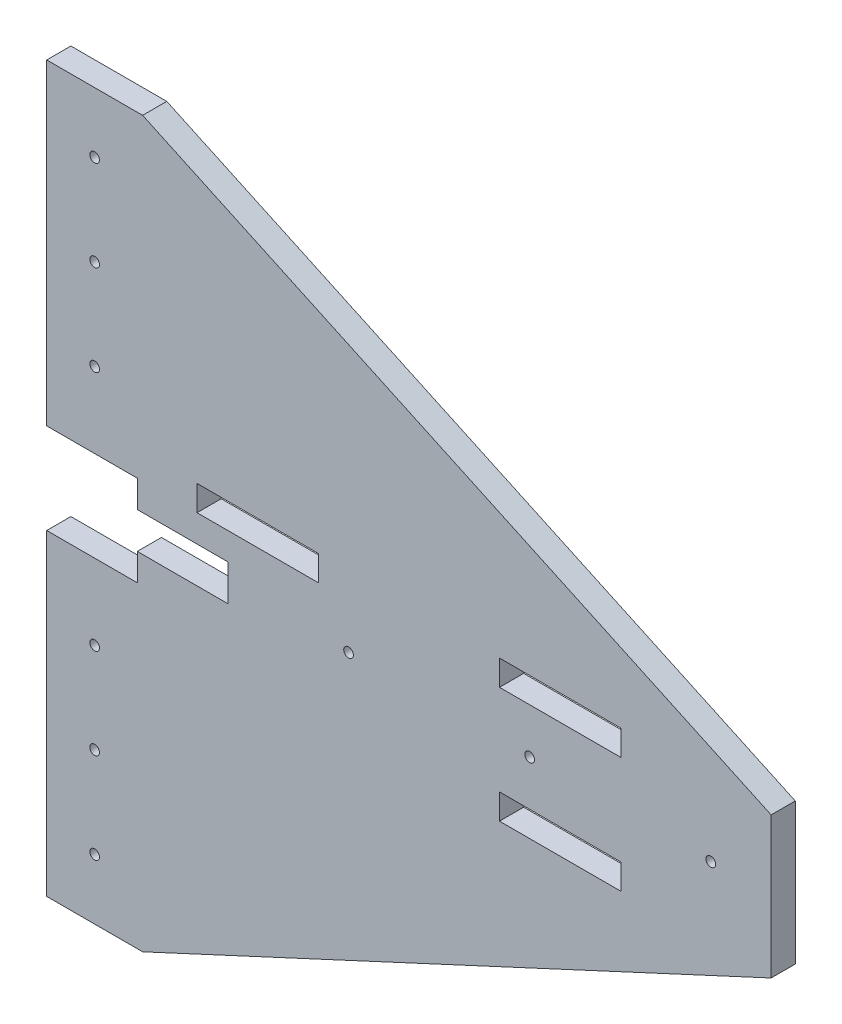
ISO-10303-21;
HEADER;
FILE_DESCRIPTION(('STEP AP214'),'2;1');
FILE_NAME('part.step','',(''),(''),'','','');
FILE_SCHEMA(('AUTOMOTIVE_DESIGN { 1 0 10303 214 1 1 1 1 }'));
ENDSEC;
DATA;
#1=APPLICATION_CONTEXT('core data for automotive mechanical design processes');
#2=APPLICATION_PROTOCOL_DEFINITION('international standard','automotive_design',2000,#1);
#3=PRODUCT_CONTEXT('',#1,'mechanical');
#4=PRODUCT('Part','Part','',(#3));
#5=PRODUCT_RELATED_PRODUCT_CATEGORY('part','',(#4));
#6=PRODUCT_DEFINITION_FORMATION('','',#4);
#7=PRODUCT_DEFINITION_CONTEXT('part definition',#1,'design');
#8=PRODUCT_DEFINITION('design','',#6,#7);
#9=PRODUCT_DEFINITION_SHAPE('','',#8);
#10=(LENGTH_UNIT() NAMED_UNIT(*) SI_UNIT(.MILLI.,.METRE.));
#11=(NAMED_UNIT(*) PLANE_ANGLE_UNIT() SI_UNIT($,.RADIAN.));
#12=(NAMED_UNIT(*) SI_UNIT($,.STERADIAN.) SOLID_ANGLE_UNIT());
#13=UNCERTAINTY_MEASURE_WITH_UNIT(LENGTH_MEASURE(1.E-05),#10,'distance_accuracy_value','');
#14=(GEOMETRIC_REPRESENTATION_CONTEXT(3) GLOBAL_UNCERTAINTY_ASSIGNED_CONTEXT((#13)) GLOBAL_UNIT_ASSIGNED_CONTEXT((#10,
#11,#12)) REPRESENTATION_CONTEXT('',''));
#15=CARTESIAN_POINT('',(0.,0.,0.));
#16=DIRECTION('',(0.,0.,1.));
#17=DIRECTION('',(1.,0.,0.));
#18=AXIS2_PLACEMENT_3D('',#15,#16,#17);
#19=CARTESIAN_POINT('',(15.,0.,4.));
#20=DIRECTION('',(1.,0.,0.));
#21=DIRECTION('',(0.,1.,0.));
#22=AXIS2_PLACEMENT_3D('',#19,#20,#21);
#23=PLANE('',#22);
#24=DIRECTION('',(0.,-1.,0.));
#25=VECTOR('',#24,1.);
#26=CARTESIAN_POINT('',(15.,0.,0.));
#27=LINE('',#26,#25);
#28=CARTESIAN_POINT('',(15.,15.,0.));
#29=VERTEX_POINT('',#28);
#30=CARTESIAN_POINT('',(15.,10.5,0.));
#31=VERTEX_POINT('',#30);
#32=EDGE_CURVE('E422',#29,#31,#27,.T.);
#33=ORIENTED_EDGE('',*,*,#32,.T.);
#34=DIRECTION('',(0.,0.,1.));
#35=VECTOR('',#34,1.);
#36=CARTESIAN_POINT('',(15.,10.5,0.));
#37=LINE('',#36,#35);
#38=CARTESIAN_POINT('',(15.,10.5,4.));
#39=VERTEX_POINT('',#38);
#40=EDGE_CURVE('E236',#31,#39,#37,.T.);
#41=ORIENTED_EDGE('',*,*,#40,.T.);
#42=DIRECTION('',(0.,-1.,0.));
#43=VECTOR('',#42,1.);
#44=CARTESIAN_POINT('',(15.,0.,4.));
#45=LINE('',#44,#43);
#46=CARTESIAN_POINT('',(15.,15.,4.));
#47=VERTEX_POINT('',#46);
#48=EDGE_CURVE('E400',#47,#39,#45,.T.);
#49=ORIENTED_EDGE('',*,*,#48,.F.);
#50=DIRECTION('',(0.,0.,-1.));
#51=VECTOR('',#50,1.);
#52=CARTESIAN_POINT('',(15.,15.,4.));
#53=LINE('',#52,#51);
#54=EDGE_CURVE('E431',#47,#29,#53,.T.);
#55=ORIENTED_EDGE('',*,*,#54,.T.);
#56=EDGE_LOOP('',(#33,#41,#49,#55));
#57=FACE_BOUND('',#56,.T.);
#58=ADVANCED_FACE('F33',(#57),#23,.F.);
#59=CARTESIAN_POINT('',(0.,0.,4.));
#60=DIRECTION('',(0.,0.,-1.));
#61=DIRECTION('',(-1.,0.,0.));
#62=AXIS2_PLACEMENT_3D('',#59,#60,#61);
#63=PLANE('',#62);
#64=CARTESIAN_POINT('',(50.,7.5,4.));
#65=DIRECTION('',(0.,0.,1.));
#66=DIRECTION('',(1.,0.,0.));
#67=AXIS2_PLACEMENT_3D('',#64,#65,#66);
#68=CIRCLE('',#67,0.799999999999995);
#69=CARTESIAN_POINT('',(50.8,7.5,4.));
#70=VERTEX_POINT('',#69);
#71=EDGE_CURVE('E239',#70,#70,#68,.T.);
#72=ORIENTED_EDGE('',*,*,#71,.F.);
#73=EDGE_LOOP('',(#72));
#74=FACE_BOUND('',#73,.T.);
#75=CARTESIAN_POINT('',(80.,7.5,4.));
#76=DIRECTION('',(0.,0.,1.));
#77=DIRECTION('',(1.,0.,0.));
#78=AXIS2_PLACEMENT_3D('',#75,#76,#77);
#79=CIRCLE('',#78,0.799999999999995);
#80=CARTESIAN_POINT('',(80.8,7.5,4.));
#81=VERTEX_POINT('',#80);
#82=EDGE_CURVE('E245',#81,#81,#79,.T.);
#83=ORIENTED_EDGE('',*,*,#82,.F.);
#84=EDGE_LOOP('',(#83));
#85=FACE_BOUND('',#84,.T.);
#86=CARTESIAN_POINT('',(110.,7.5,4.));
#87=DIRECTION('',(0.,0.,1.));
#88=DIRECTION('',(1.,0.,0.));
#89=AXIS2_PLACEMENT_3D('',#86,#87,#88);
#90=CIRCLE('',#89,0.799999999999995);
#91=CARTESIAN_POINT('',(110.8,7.5,4.));
#92=VERTEX_POINT('',#91);
#93=EDGE_CURVE('E251',#92,#92,#90,.T.);
#94=ORIENTED_EDGE('',*,*,#93,.F.);
#95=EDGE_LOOP('',(#94));
#96=FACE_BOUND('',#95,.T.);
#97=CARTESIAN_POINT('',(7.94372646888998,-27.5,4.));
#98=DIRECTION('',(0.,0.,-1.));
#99=DIRECTION('',(1.,0.,0.));
#100=AXIS2_PLACEMENT_3D('',#97,#98,#99);
#101=CIRCLE('',#100,0.800000000000005);
#102=CARTESIAN_POINT('',(8.74372646888999,-27.5,4.));
#103=VERTEX_POINT('',#102);
#104=EDGE_CURVE('E263',#103,#103,#101,.T.);
#105=ORIENTED_EDGE('',*,*,#104,.T.);
#106=EDGE_LOOP('',(#105));
#107=FACE_BOUND('',#106,.T.);
#108=CARTESIAN_POINT('',(7.94372646888997,27.5,4.));
#109=DIRECTION('',(0.,0.,1.));
#110=DIRECTION('',(1.,0.,0.));
#111=AXIS2_PLACEMENT_3D('',#108,#109,#110);
#112=CIRCLE('',#111,0.800000000000005);
#113=CARTESIAN_POINT('',(8.74372646888997,27.5,4.));
#114=VERTEX_POINT('',#113);
#115=EDGE_CURVE('E11',#114,#114,#112,.T.);
#116=ORIENTED_EDGE('',*,*,#115,.F.);
#117=EDGE_LOOP('',(#116));
#118=FACE_BOUND('',#117,.T.);
#119=DIRECTION('',(1.,0.,0.));
#120=VECTOR('',#119,1.);
#121=CARTESIAN_POINT('',(24.9,15.,4.));
#122=LINE('',#121,#120);
#123=CARTESIAN_POINT('',(24.9,15.,4.));
#124=VERTEX_POINT('',#123);
#125=CARTESIAN_POINT('',(45.,15.,4.));
#126=VERTEX_POINT('',#125);
#127=EDGE_CURVE('E290',#124,#126,#122,.T.);
#128=ORIENTED_EDGE('',*,*,#127,.F.);
#129=DIRECTION('',(0.,-1.,0.));
#130=VECTOR('',#129,1.);
#131=CARTESIAN_POINT('',(24.9,15.,4.));
#132=LINE('',#131,#130);
#133=CARTESIAN_POINT('',(24.9,19.2,4.));
#134=VERTEX_POINT('',#133);
#135=EDGE_CURVE('E297',#134,#124,#132,.T.);
#136=ORIENTED_EDGE('',*,*,#135,.F.);
#137=DIRECTION('',(-1.,0.,0.));
#138=VECTOR('',#137,1.);
#139=CARTESIAN_POINT('',(24.9,19.2,4.));
#140=LINE('',#139,#138);
#141=CARTESIAN_POINT('',(45.,19.2,4.));
#142=VERTEX_POINT('',#141);
#143=EDGE_CURVE('E295',#142,#134,#140,.T.);
#144=ORIENTED_EDGE('',*,*,#143,.F.);
#145=DIRECTION('',(0.,1.,0.));
#146=VECTOR('',#145,1.);
#147=CARTESIAN_POINT('',(45.,15.,4.));
#148=LINE('',#147,#146);
#149=EDGE_CURVE('E292',#126,#142,#148,.T.);
#150=ORIENTED_EDGE('',*,*,#149,.F.);
#151=EDGE_LOOP('',(#128,#136,#144,#150));
#152=FACE_BOUND('',#151,.T.);
#153=DIRECTION('',(0.,-1.,0.));
#154=VECTOR('',#153,1.);
#155=CARTESIAN_POINT('',(75.,-4.2,4.));
#156=LINE('',#155,#154);
#157=CARTESIAN_POINT('',(75.,0.,4.));
#158=VERTEX_POINT('',#157);
#159=CARTESIAN_POINT('',(75.,-4.2,4.));
#160=VERTEX_POINT('',#159);
#161=EDGE_CURVE('E350',#158,#160,#156,.T.);
#162=ORIENTED_EDGE('',*,*,#161,.F.);
#163=DIRECTION('',(-1.,0.,0.));
#164=VECTOR('',#163,1.);
#165=CARTESIAN_POINT('',(75.,0.,4.));
#166=LINE('',#165,#164);
#167=CARTESIAN_POINT('',(95.1,0.,4.));
#168=VERTEX_POINT('',#167);
#169=EDGE_CURVE('E358',#168,#158,#166,.T.);
#170=ORIENTED_EDGE('',*,*,#169,.F.);
#171=DIRECTION('',(0.,1.,0.));
#172=VECTOR('',#171,1.);
#173=CARTESIAN_POINT('',(95.1,-4.2,4.));
#174=LINE('',#173,#172);
#175=CARTESIAN_POINT('',(95.1,-4.2,4.));
#176=VERTEX_POINT('',#175);
#177=EDGE_CURVE('E355',#176,#168,#174,.T.);
#178=ORIENTED_EDGE('',*,*,#177,.F.);
#179=DIRECTION('',(1.,0.,0.));
#180=VECTOR('',#179,1.);
#181=CARTESIAN_POINT('',(75.,-4.2,4.));
#182=LINE('',#181,#180);
#183=EDGE_CURVE('E352',#160,#176,#182,.T.);
#184=ORIENTED_EDGE('',*,*,#183,.F.);
#185=EDGE_LOOP('',(#162,#170,#178,#184));
#186=FACE_BOUND('',#185,.T.);
#187=ORIENTED_EDGE('',*,*,#48,.T.);
#188=DIRECTION('',(-1.,0.,0.));
#189=VECTOR('',#188,1.);
#190=CARTESIAN_POINT('',(15.,10.5,4.));
#191=LINE('',#190,#189);
#192=CARTESIAN_POINT('',(30.,10.5,4.));
#193=VERTEX_POINT('',#192);
#194=EDGE_CURVE('E228',#193,#39,#191,.T.);
#195=ORIENTED_EDGE('',*,*,#194,.F.);
#196=DIRECTION('',(0.,1.,0.));
#197=VECTOR('',#196,1.);
#198=CARTESIAN_POINT('',(30.,4.5,4.));
#199=LINE('',#198,#197);
#200=CARTESIAN_POINT('',(30.,4.5,4.));
#201=VERTEX_POINT('',#200);
#202=EDGE_CURVE('E230',#201,#193,#199,.T.);
#203=ORIENTED_EDGE('',*,*,#202,.F.);
#204=DIRECTION('',(1.,0.,0.));
#205=VECTOR('',#204,1.);
#206=CARTESIAN_POINT('',(15.,4.5,4.));
#207=LINE('',#206,#205);
#208=CARTESIAN_POINT('',(15.,4.5,4.));
#209=VERTEX_POINT('',#208);
#210=EDGE_CURVE('E208',#209,#201,#207,.T.);
#211=ORIENTED_EDGE('',*,*,#210,.F.);
#212=CARTESIAN_POINT('',(15.,0.,4.));
#213=VERTEX_POINT('',#212);
#214=EDGE_CURVE('E399',#209,#213,#45,.T.);
#215=ORIENTED_EDGE('',*,*,#214,.T.);
#216=DIRECTION('',(-1.,0.,0.));
#217=VECTOR('',#216,1.);
#218=CARTESIAN_POINT('',(0.,0.,4.));
#219=LINE('',#218,#217);
#220=CARTESIAN_POINT('',(0.,0.,4.));
#221=VERTEX_POINT('',#220);
#222=EDGE_CURVE('E403',#213,#221,#219,.T.);
#223=ORIENTED_EDGE('',*,*,#222,.T.);
#224=DIRECTION('',(0.,-1.,0.));
#225=VECTOR('',#224,1.);
#226=CARTESIAN_POINT('',(0.,-52.5,4.));
#227=LINE('',#226,#225);
#228=CARTESIAN_POINT('',(0.,-52.5,4.));
#229=VERTEX_POINT('',#228);
#230=EDGE_CURVE('E381',#221,#229,#227,.T.);
#231=ORIENTED_EDGE('',*,*,#230,.T.);
#232=DIRECTION('',(1.,0.,0.));
#233=VECTOR('',#232,1.);
#234=CARTESIAN_POINT('',(15.8874529377799,-52.5,4.));
#235=LINE('',#234,#233);
#236=CARTESIAN_POINT('',(15.8874529377799,-52.5,4.));
#237=VERTEX_POINT('',#236);
#238=EDGE_CURVE('E384',#229,#237,#235,.T.);
#239=ORIENTED_EDGE('',*,*,#238,.T.);
#240=DIRECTION('',(0.907135283649032,0.420839134538353,0.));
#241=VECTOR('',#240,1.);
#242=CARTESIAN_POINT('',(120.,-4.2,4.));
#243=LINE('',#242,#241);
#244=CARTESIAN_POINT('',(120.,-4.2,4.));
#245=VERTEX_POINT('',#244);
#246=EDGE_CURVE('E387',#237,#245,#243,.T.);
#247=ORIENTED_EDGE('',*,*,#246,.T.);
#248=DIRECTION('',(0.,1.,0.));
#249=VECTOR('',#248,1.);
#250=CARTESIAN_POINT('',(120.,19.2,4.));
#251=LINE('',#250,#249);
#252=CARTESIAN_POINT('',(120.,19.2,4.));
#253=VERTEX_POINT('',#252);
#254=EDGE_CURVE('E389',#245,#253,#251,.T.);
#255=ORIENTED_EDGE('',*,*,#254,.T.);
#256=DIRECTION('',(-0.907135283649032,0.420839134538353,0.));
#257=VECTOR('',#256,1.);
#258=CARTESIAN_POINT('',(15.8874529377799,67.5,4.));
#259=LINE('',#258,#257);
#260=CARTESIAN_POINT('',(15.8874529377799,67.5,4.));
#261=VERTEX_POINT('',#260);
#262=EDGE_CURVE('E391',#253,#261,#259,.T.);
#263=ORIENTED_EDGE('',*,*,#262,.T.);
#264=DIRECTION('',(-1.,0.,0.));
#265=VECTOR('',#264,1.);
#266=CARTESIAN_POINT('',(0.,67.5,4.));
#267=LINE('',#266,#265);
#268=CARTESIAN_POINT('',(0.,67.5,4.));
#269=VERTEX_POINT('',#268);
#270=EDGE_CURVE('E393',#261,#269,#267,.T.);
#271=ORIENTED_EDGE('',*,*,#270,.T.);
#272=DIRECTION('',(0.,-1.,0.));
#273=VECTOR('',#272,1.);
#274=CARTESIAN_POINT('',(0.,15.,4.));
#275=LINE('',#274,#273);
#276=CARTESIAN_POINT('',(0.,15.,4.));
#277=VERTEX_POINT('',#276);
#278=EDGE_CURVE('E395',#269,#277,#275,.T.);
#279=ORIENTED_EDGE('',*,*,#278,.T.);
#280=DIRECTION('',(1.,0.,0.));
#281=VECTOR('',#280,1.);
#282=CARTESIAN_POINT('',(0.,15.,4.));
#283=LINE('',#282,#281);
#284=EDGE_CURVE('E397',#277,#47,#283,.T.);
#285=ORIENTED_EDGE('',*,*,#284,.T.);
#286=EDGE_LOOP('',(#187,#195,#203,#211,#215,#223,#231,#239,#247,#255,#263,#271,#279,#285));
#287=FACE_BOUND('',#286,.T.);
#288=DIRECTION('',(-1.,0.,0.));
#289=VECTOR('',#288,1.);
#290=CARTESIAN_POINT('',(75.,19.2,4.));
#291=LINE('',#290,#289);
#292=CARTESIAN_POINT('',(95.1,19.2,4.));
#293=VERTEX_POINT('',#292);
#294=CARTESIAN_POINT('',(75.,19.2,4.));
#295=VERTEX_POINT('',#294);
#296=EDGE_CURVE('E319',#293,#295,#291,.T.);
#297=ORIENTED_EDGE('',*,*,#296,.F.);
#298=DIRECTION('',(0.,1.,0.));
#299=VECTOR('',#298,1.);
#300=CARTESIAN_POINT('',(95.1,19.2,4.));
#301=LINE('',#300,#299);
#302=CARTESIAN_POINT('',(95.1,15.,4.));
#303=VERTEX_POINT('',#302);
#304=EDGE_CURVE('E327',#303,#293,#301,.T.);
#305=ORIENTED_EDGE('',*,*,#304,.F.);
#306=DIRECTION('',(1.,0.,0.));
#307=VECTOR('',#306,1.);
#308=CARTESIAN_POINT('',(75.,15.,4.));
#309=LINE('',#308,#307);
#310=CARTESIAN_POINT('',(75.,15.,4.));
#311=VERTEX_POINT('',#310);
#312=EDGE_CURVE('E324',#311,#303,#309,.T.);
#313=ORIENTED_EDGE('',*,*,#312,.F.);
#314=DIRECTION('',(0.,-1.,0.));
#315=VECTOR('',#314,1.);
#316=CARTESIAN_POINT('',(75.,19.2,4.));
#317=LINE('',#316,#315);
#318=EDGE_CURVE('E321',#295,#311,#317,.T.);
#319=ORIENTED_EDGE('',*,*,#318,.F.);
#320=EDGE_LOOP('',(#297,#305,#313,#319));
#321=FACE_BOUND('',#320,.T.);
#322=CARTESIAN_POINT('',(7.94372646888997,57.5,4.));
#323=DIRECTION('',(0.,0.,1.));
#324=DIRECTION('',(1.,0.,0.));
#325=AXIS2_PLACEMENT_3D('',#322,#323,#324);
#326=CIRCLE('',#325,0.800000000000005);
#327=CARTESIAN_POINT('',(8.74372646888997,57.5,4.));
#328=VERTEX_POINT('',#327);
#329=EDGE_CURVE('E283',#328,#328,#326,.T.);
#330=ORIENTED_EDGE('',*,*,#329,.F.);
#331=EDGE_LOOP('',(#330));
#332=FACE_BOUND('',#331,.T.);
#333=CARTESIAN_POINT('',(7.94372646888997,42.5,4.));
#334=DIRECTION('',(0.,0.,1.));
#335=DIRECTION('',(1.,0.,0.));
#336=AXIS2_PLACEMENT_3D('',#333,#334,#335);
#337=CIRCLE('',#336,0.800000000000005);
#338=CARTESIAN_POINT('',(8.74372646888997,42.5,4.));
#339=VERTEX_POINT('',#338);
#340=EDGE_CURVE('E280',#339,#339,#337,.T.);
#341=ORIENTED_EDGE('',*,*,#340,.F.);
#342=EDGE_LOOP('',(#341));
#343=FACE_BOUND('',#342,.T.);
#344=CARTESIAN_POINT('',(7.94372646888999,-42.5,4.));
#345=DIRECTION('',(0.,0.,-1.));
#346=DIRECTION('',(1.,0.,0.));
#347=AXIS2_PLACEMENT_3D('',#344,#345,#346);
#348=CIRCLE('',#347,0.800000000000005);
#349=CARTESIAN_POINT('',(8.74372646888999,-42.5,4.));
#350=VERTEX_POINT('',#349);
#351=EDGE_CURVE('E269',#350,#350,#348,.T.);
#352=ORIENTED_EDGE('',*,*,#351,.T.);
#353=EDGE_LOOP('',(#352));
#354=FACE_BOUND('',#353,.T.);
#355=CARTESIAN_POINT('',(7.94372646888998,-12.5,4.));
#356=DIRECTION('',(0.,0.,-1.));
#357=DIRECTION('',(1.,0.,0.));
#358=AXIS2_PLACEMENT_3D('',#355,#356,#357);
#359=CIRCLE('',#358,0.800000000000005);
#360=CARTESIAN_POINT('',(8.74372646888998,-12.5,4.));
#361=VERTEX_POINT('',#360);
#362=EDGE_CURVE('E257',#361,#361,#359,.T.);
#363=ORIENTED_EDGE('',*,*,#362,.T.);
#364=EDGE_LOOP('',(#363));
#365=FACE_BOUND('',#364,.T.);
#366=ADVANCED_FACE('F465',(#74,#85,#96,#107,#118,#152,#186,#287,#321,#332,#343,#354,#365),#63,.F.);
#367=CARTESIAN_POINT('',(0.,0.,0.));
#368=DIRECTION('',(0.,0.,-1.));
#369=DIRECTION('',(-1.,0.,0.));
#370=AXIS2_PLACEMENT_3D('',#367,#368,#369);
#371=PLANE('',#370);
#372=DIRECTION('',(-1.,0.,0.));
#373=VECTOR('',#372,1.);
#374=CARTESIAN_POINT('',(15.,10.5,0.));
#375=LINE('',#374,#373);
#376=CARTESIAN_POINT('',(30.,10.5,0.));
#377=VERTEX_POINT('',#376);
#378=EDGE_CURVE('E221',#377,#31,#375,.T.);
#379=ORIENTED_EDGE('',*,*,#378,.T.);
#380=ORIENTED_EDGE('',*,*,#32,.F.);
#381=DIRECTION('',(1.,0.,0.));
#382=VECTOR('',#381,1.);
#383=CARTESIAN_POINT('',(0.,15.,0.));
#384=LINE('',#383,#382);
#385=CARTESIAN_POINT('',(0.,15.,0.));
#386=VERTEX_POINT('',#385);
#387=EDGE_CURVE('E420',#386,#29,#384,.T.);
#388=ORIENTED_EDGE('',*,*,#387,.F.);
#389=DIRECTION('',(0.,-1.,0.));
#390=VECTOR('',#389,1.);
#391=CARTESIAN_POINT('',(0.,15.,0.));
#392=LINE('',#391,#390);
#393=CARTESIAN_POINT('',(0.,67.5,0.));
#394=VERTEX_POINT('',#393);
#395=EDGE_CURVE('E418',#394,#386,#392,.T.);
#396=ORIENTED_EDGE('',*,*,#395,.F.);
#397=DIRECTION('',(-1.,0.,0.));
#398=VECTOR('',#397,1.);
#399=CARTESIAN_POINT('',(0.,67.5,0.));
#400=LINE('',#399,#398);
#401=CARTESIAN_POINT('',(15.8874529377799,67.5,0.));
#402=VERTEX_POINT('',#401);
#403=EDGE_CURVE('E416',#402,#394,#400,.T.);
#404=ORIENTED_EDGE('',*,*,#403,.F.);
#405=DIRECTION('',(-0.907135283649032,0.420839134538353,0.));
#406=VECTOR('',#405,1.);
#407=CARTESIAN_POINT('',(15.8874529377799,67.5,0.));
#408=LINE('',#407,#406);
#409=CARTESIAN_POINT('',(120.,19.2,0.));
#410=VERTEX_POINT('',#409);
#411=EDGE_CURVE('E414',#410,#402,#408,.T.);
#412=ORIENTED_EDGE('',*,*,#411,.F.);
#413=DIRECTION('',(0.,1.,0.));
#414=VECTOR('',#413,1.);
#415=CARTESIAN_POINT('',(120.,19.2,0.));
#416=LINE('',#415,#414);
#417=CARTESIAN_POINT('',(120.,-4.2,0.));
#418=VERTEX_POINT('',#417);
#419=EDGE_CURVE('E412',#418,#410,#416,.T.);
#420=ORIENTED_EDGE('',*,*,#419,.F.);
#421=DIRECTION('',(0.907135283649032,0.420839134538353,0.));
#422=VECTOR('',#421,1.);
#423=CARTESIAN_POINT('',(120.,-4.2,0.));
#424=LINE('',#423,#422);
#425=CARTESIAN_POINT('',(15.8874529377799,-52.5,0.));
#426=VERTEX_POINT('',#425);
#427=EDGE_CURVE('E410',#426,#418,#424,.T.);
#428=ORIENTED_EDGE('',*,*,#427,.F.);
#429=DIRECTION('',(1.,0.,0.));
#430=VECTOR('',#429,1.);
#431=CARTESIAN_POINT('',(15.8874529377799,-52.5,0.));
#432=LINE('',#431,#430);
#433=CARTESIAN_POINT('',(0.,-52.5,0.));
#434=VERTEX_POINT('',#433);
#435=EDGE_CURVE('E408',#434,#426,#432,.T.);
#436=ORIENTED_EDGE('',*,*,#435,.F.);
#437=DIRECTION('',(0.,-1.,0.));
#438=VECTOR('',#437,1.);
#439=CARTESIAN_POINT('',(0.,-52.5,0.));
#440=LINE('',#439,#438);
#441=CARTESIAN_POINT('',(0.,0.,0.));
#442=VERTEX_POINT('',#441);
#443=EDGE_CURVE('E380',#442,#434,#440,.T.);
#444=ORIENTED_EDGE('',*,*,#443,.F.);
#445=DIRECTION('',(-1.,0.,0.));
#446=VECTOR('',#445,1.);
#447=CARTESIAN_POINT('',(0.,0.,0.));
#448=LINE('',#447,#446);
#449=CARTESIAN_POINT('',(15.,0.,0.));
#450=VERTEX_POINT('',#449);
#451=EDGE_CURVE('E385',#450,#442,#448,.T.);
#452=ORIENTED_EDGE('',*,*,#451,.F.);
#453=CARTESIAN_POINT('',(15.,4.5,0.));
#454=VERTEX_POINT('',#453);
#455=EDGE_CURVE('E227',#454,#450,#27,.T.);
#456=ORIENTED_EDGE('',*,*,#455,.F.);
#457=DIRECTION('',(1.,0.,0.));
#458=VECTOR('',#457,1.);
#459=CARTESIAN_POINT('',(15.,4.5,0.));
#460=LINE('',#459,#458);
#461=CARTESIAN_POINT('',(30.,4.5,0.));
#462=VERTEX_POINT('',#461);
#463=EDGE_CURVE('E48',#454,#462,#460,.T.);
#464=ORIENTED_EDGE('',*,*,#463,.T.);
#465=DIRECTION('',(0.,1.,0.));
#466=VECTOR('',#465,1.);
#467=CARTESIAN_POINT('',(30.,4.5,0.));
#468=LINE('',#467,#466);
#469=EDGE_CURVE('E216',#462,#377,#468,.T.);
#470=ORIENTED_EDGE('',*,*,#469,.T.);
#471=EDGE_LOOP('',(#379,#380,#388,#396,#404,#412,#420,#428,#436,#444,#452,#456,#464,#470));
#472=FACE_BOUND('',#471,.T.);
#473=CARTESIAN_POINT('',(50.,7.5,0.));
#474=DIRECTION('',(0.,0.,1.));
#475=DIRECTION('',(1.,0.,0.));
#476=AXIS2_PLACEMENT_3D('',#473,#474,#475);
#477=CIRCLE('',#476,0.799999999999995);
#478=CARTESIAN_POINT('',(50.8,7.5,0.));
#479=VERTEX_POINT('',#478);
#480=EDGE_CURVE('E242',#479,#479,#477,.T.);
#481=ORIENTED_EDGE('',*,*,#480,.T.);
#482=EDGE_LOOP('',(#481));
#483=FACE_BOUND('',#482,.T.);
#484=CARTESIAN_POINT('',(80.,7.5,0.));
#485=DIRECTION('',(0.,0.,1.));
#486=DIRECTION('',(1.,0.,0.));
#487=AXIS2_PLACEMENT_3D('',#484,#485,#486);
#488=CIRCLE('',#487,0.799999999999995);
#489=CARTESIAN_POINT('',(80.8,7.5,0.));
#490=VERTEX_POINT('',#489);
#491=EDGE_CURVE('E248',#490,#490,#488,.T.);
#492=ORIENTED_EDGE('',*,*,#491,.T.);
#493=EDGE_LOOP('',(#492));
#494=FACE_BOUND('',#493,.T.);
#495=CARTESIAN_POINT('',(110.,7.5,0.));
#496=DIRECTION('',(0.,0.,1.));
#497=DIRECTION('',(1.,0.,0.));
#498=AXIS2_PLACEMENT_3D('',#495,#496,#497);
#499=CIRCLE('',#498,0.799999999999995);
#500=CARTESIAN_POINT('',(110.8,7.5,0.));
#501=VERTEX_POINT('',#500);
#502=EDGE_CURVE('E254',#501,#501,#499,.T.);
#503=ORIENTED_EDGE('',*,*,#502,.T.);
#504=EDGE_LOOP('',(#503));
#505=FACE_BOUND('',#504,.T.);
#506=CARTESIAN_POINT('',(7.94372646888998,-27.5,0.));
#507=DIRECTION('',(0.,0.,-1.));
#508=DIRECTION('',(1.,0.,0.));
#509=AXIS2_PLACEMENT_3D('',#506,#507,#508);
#510=CIRCLE('',#509,0.800000000000005);
#511=CARTESIAN_POINT('',(8.74372646888999,-27.5,0.));
#512=VERTEX_POINT('',#511);
#513=EDGE_CURVE('E266',#512,#512,#510,.T.);
#514=ORIENTED_EDGE('',*,*,#513,.F.);
#515=EDGE_LOOP('',(#514));
#516=FACE_BOUND('',#515,.T.);
#517=CARTESIAN_POINT('',(7.94372646888997,27.5,0.));
#518=DIRECTION('',(0.,0.,1.));
#519=DIRECTION('',(1.,0.,0.));
#520=AXIS2_PLACEMENT_3D('',#517,#518,#519);
#521=CIRCLE('',#520,0.800000000000005);
#522=CARTESIAN_POINT('',(8.74372646888997,27.5,0.));
#523=VERTEX_POINT('',#522);
#524=EDGE_CURVE('E41',#523,#523,#521,.T.);
#525=ORIENTED_EDGE('',*,*,#524,.T.);
#526=EDGE_LOOP('',(#525));
#527=FACE_BOUND('',#526,.T.);
#528=DIRECTION('',(0.,-1.,0.));
#529=VECTOR('',#528,1.);
#530=CARTESIAN_POINT('',(24.9,15.,0.));
#531=LINE('',#530,#529);
#532=CARTESIAN_POINT('',(24.9,19.2,0.));
#533=VERTEX_POINT('',#532);
#534=CARTESIAN_POINT('',(24.9,15.,0.));
#535=VERTEX_POINT('',#534);
#536=EDGE_CURVE('E293',#533,#535,#531,.T.);
#537=ORIENTED_EDGE('',*,*,#536,.T.);
#538=DIRECTION('',(1.,0.,0.));
#539=VECTOR('',#538,1.);
#540=CARTESIAN_POINT('',(24.9,15.,0.));
#541=LINE('',#540,#539);
#542=CARTESIAN_POINT('',(45.,15.,0.));
#543=VERTEX_POINT('',#542);
#544=EDGE_CURVE('E287',#535,#543,#541,.T.);
#545=ORIENTED_EDGE('',*,*,#544,.T.);
#546=DIRECTION('',(0.,1.,0.));
#547=VECTOR('',#546,1.);
#548=CARTESIAN_POINT('',(45.,15.,0.));
#549=LINE('',#548,#547);
#550=CARTESIAN_POINT('',(45.,19.2,0.));
#551=VERTEX_POINT('',#550);
#552=EDGE_CURVE('E302',#543,#551,#549,.T.);
#553=ORIENTED_EDGE('',*,*,#552,.T.);
#554=DIRECTION('',(-1.,0.,0.));
#555=VECTOR('',#554,1.);
#556=CARTESIAN_POINT('',(24.9,19.2,0.));
#557=LINE('',#556,#555);
#558=EDGE_CURVE('E305',#551,#533,#557,.T.);
#559=ORIENTED_EDGE('',*,*,#558,.T.);
#560=EDGE_LOOP('',(#537,#545,#553,#559));
#561=FACE_BOUND('',#560,.T.);
#562=DIRECTION('',(-1.,0.,0.));
#563=VECTOR('',#562,1.);
#564=CARTESIAN_POINT('',(75.,0.,0.));
#565=LINE('',#564,#563);
#566=CARTESIAN_POINT('',(95.1,0.,0.));
#567=VERTEX_POINT('',#566);
#568=CARTESIAN_POINT('',(75.,0.,0.));
#569=VERTEX_POINT('',#568);
#570=EDGE_CURVE('E353',#567,#569,#565,.T.);
#571=ORIENTED_EDGE('',*,*,#570,.T.);
#572=DIRECTION('',(0.,-1.,0.));
#573=VECTOR('',#572,1.);
#574=CARTESIAN_POINT('',(75.,-4.2,0.));
#575=LINE('',#574,#573);
#576=CARTESIAN_POINT('',(75.,-4.2,0.));
#577=VERTEX_POINT('',#576);
#578=EDGE_CURVE('E349',#569,#577,#575,.T.);
#579=ORIENTED_EDGE('',*,*,#578,.T.);
#580=DIRECTION('',(1.,0.,0.));
#581=VECTOR('',#580,1.);
#582=CARTESIAN_POINT('',(75.,-4.2,0.));
#583=LINE('',#582,#581);
#584=CARTESIAN_POINT('',(95.1,-4.2,0.));
#585=VERTEX_POINT('',#584);
#586=EDGE_CURVE('E363',#577,#585,#583,.T.);
#587=ORIENTED_EDGE('',*,*,#586,.T.);
#588=DIRECTION('',(0.,1.,0.));
#589=VECTOR('',#588,1.);
#590=CARTESIAN_POINT('',(95.1,-4.2,0.));
#591=LINE('',#590,#589);
#592=EDGE_CURVE('E366',#585,#567,#591,.T.);
#593=ORIENTED_EDGE('',*,*,#592,.T.);
#594=EDGE_LOOP('',(#571,#579,#587,#593));
#595=FACE_BOUND('',#594,.T.);
#596=DIRECTION('',(0.,1.,0.));
#597=VECTOR('',#596,1.);
#598=CARTESIAN_POINT('',(95.1,19.2,0.));
#599=LINE('',#598,#597);
#600=CARTESIAN_POINT('',(95.1,15.,0.));
#601=VERTEX_POINT('',#600);
#602=CARTESIAN_POINT('',(95.1,19.2,0.));
#603=VERTEX_POINT('',#602);
#604=EDGE_CURVE('E322',#601,#603,#599,.T.);
#605=ORIENTED_EDGE('',*,*,#604,.T.);
#606=DIRECTION('',(-1.,0.,0.));
#607=VECTOR('',#606,1.);
#608=CARTESIAN_POINT('',(75.,19.2,0.));
#609=LINE('',#608,#607);
#610=CARTESIAN_POINT('',(75.,19.2,0.));
#611=VERTEX_POINT('',#610);
#612=EDGE_CURVE('E318',#603,#611,#609,.T.);
#613=ORIENTED_EDGE('',*,*,#612,.T.);
#614=DIRECTION('',(0.,-1.,0.));
#615=VECTOR('',#614,1.);
#616=CARTESIAN_POINT('',(75.,19.2,0.));
#617=LINE('',#616,#615);
#618=CARTESIAN_POINT('',(75.,15.,0.));
#619=VERTEX_POINT('',#618);
#620=EDGE_CURVE('E332',#611,#619,#617,.T.);
#621=ORIENTED_EDGE('',*,*,#620,.T.);
#622=DIRECTION('',(1.,0.,0.));
#623=VECTOR('',#622,1.);
#624=CARTESIAN_POINT('',(75.,15.,0.));
#625=LINE('',#624,#623);
#626=EDGE_CURVE('E335',#619,#601,#625,.T.);
#627=ORIENTED_EDGE('',*,*,#626,.T.);
#628=EDGE_LOOP('',(#605,#613,#621,#627));
#629=FACE_BOUND('',#628,.T.);
#630=CARTESIAN_POINT('',(7.94372646888997,57.5,0.));
#631=DIRECTION('',(0.,0.,1.));
#632=DIRECTION('',(1.,0.,0.));
#633=AXIS2_PLACEMENT_3D('',#630,#631,#632);
#634=CIRCLE('',#633,0.800000000000005);
#635=CARTESIAN_POINT('',(8.74372646888997,57.5,0.));
#636=VERTEX_POINT('',#635);
#637=EDGE_CURVE('E284',#636,#636,#634,.T.);
#638=ORIENTED_EDGE('',*,*,#637,.T.);
#639=EDGE_LOOP('',(#638));
#640=FACE_BOUND('',#639,.T.);
#641=CARTESIAN_POINT('',(7.94372646888997,42.5,0.));
#642=DIRECTION('',(0.,0.,1.));
#643=DIRECTION('',(1.,0.,0.));
#644=AXIS2_PLACEMENT_3D('',#641,#642,#643);
#645=CIRCLE('',#644,0.800000000000005);
#646=CARTESIAN_POINT('',(8.74372646888997,42.5,0.));
#647=VERTEX_POINT('',#646);
#648=EDGE_CURVE('E275',#647,#647,#645,.T.);
#649=ORIENTED_EDGE('',*,*,#648,.T.);
#650=EDGE_LOOP('',(#649));
#651=FACE_BOUND('',#650,.T.);
#652=CARTESIAN_POINT('',(7.94372646888999,-42.5,0.));
#653=DIRECTION('',(0.,0.,-1.));
#654=DIRECTION('',(1.,0.,0.));
#655=AXIS2_PLACEMENT_3D('',#652,#653,#654);
#656=CIRCLE('',#655,0.800000000000005);
#657=CARTESIAN_POINT('',(8.74372646888999,-42.5,0.));
#658=VERTEX_POINT('',#657);
#659=EDGE_CURVE('E272',#658,#658,#656,.T.);
#660=ORIENTED_EDGE('',*,*,#659,.F.);
#661=EDGE_LOOP('',(#660));
#662=FACE_BOUND('',#661,.T.);
#663=CARTESIAN_POINT('',(7.94372646888998,-12.5,0.));
#664=DIRECTION('',(0.,0.,-1.));
#665=DIRECTION('',(1.,0.,0.));
#666=AXIS2_PLACEMENT_3D('',#663,#664,#665);
#667=CIRCLE('',#666,0.800000000000005);
#668=CARTESIAN_POINT('',(8.74372646888998,-12.5,0.));
#669=VERTEX_POINT('',#668);
#670=EDGE_CURVE('E260',#669,#669,#667,.T.);
#671=ORIENTED_EDGE('',*,*,#670,.F.);
#672=EDGE_LOOP('',(#671));
#673=FACE_BOUND('',#672,.T.);
#674=ADVANCED_FACE('F224',(#472,#483,#494,#505,#516,#527,#561,#595,#629,#640,#651,#662,#673),
#371,.T.);
#675=CARTESIAN_POINT('',(0.,-52.5,4.));
#676=DIRECTION('',(1.,0.,0.));
#677=DIRECTION('',(0.,0.,-1.));
#678=AXIS2_PLACEMENT_3D('',#675,#676,#677);
#679=PLANE('',#678);
#680=ORIENTED_EDGE('',*,*,#443,.T.);
#681=DIRECTION('',(0.,0.,-1.));
#682=VECTOR('',#681,1.);
#683=CARTESIAN_POINT('',(0.,-52.5,4.));
#684=LINE('',#683,#682);
#685=EDGE_CURVE('E452',#229,#434,#684,.T.);
#686=ORIENTED_EDGE('',*,*,#685,.F.);
#687=ORIENTED_EDGE('',*,*,#230,.F.);
#688=DIRECTION('',(0.,0.,-1.));
#689=VECTOR('',#688,1.);
#690=CARTESIAN_POINT('',(0.,0.,4.));
#691=LINE('',#690,#689);
#692=EDGE_CURVE('E405',#221,#442,#691,.T.);
#693=ORIENTED_EDGE('',*,*,#692,.T.);
#694=EDGE_LOOP('',(#680,#686,#687,#693));
#695=FACE_BOUND('',#694,.T.);
#696=ADVANCED_FACE('F569',(#695),#679,.F.);
#697=CARTESIAN_POINT('',(15.8874529377799,-52.5,4.));
#698=DIRECTION('',(0.,1.,0.));
#699=DIRECTION('',(-1.,0.,0.));
#700=AXIS2_PLACEMENT_3D('',#697,#698,#699);
#701=PLANE('',#700);
#702=ORIENTED_EDGE('',*,*,#435,.T.);
#703=DIRECTION('',(0.,0.,-1.));
#704=VECTOR('',#703,1.);
#705=CARTESIAN_POINT('',(15.8874529377799,-52.5,4.));
#706=LINE('',#705,#704);
#707=EDGE_CURVE('E449',#237,#426,#706,.T.);
#708=ORIENTED_EDGE('',*,*,#707,.F.);
#709=ORIENTED_EDGE('',*,*,#238,.F.);
#710=ORIENTED_EDGE('',*,*,#685,.T.);
#711=EDGE_LOOP('',(#702,#708,#709,#710));
#712=FACE_BOUND('',#711,.T.);
#713=ADVANCED_FACE('F566',(#712),#701,.F.);
#714=CARTESIAN_POINT('',(120.,-4.2,4.));
#715=DIRECTION('',(-0.420839134538353,0.907135283649032,0.));
#716=DIRECTION('',(-0.907135283649032,-0.420839134538353,0.));
#717=AXIS2_PLACEMENT_3D('',#714,#715,#716);
#718=PLANE('',#717);
#719=ORIENTED_EDGE('',*,*,#427,.T.);
#720=DIRECTION('',(0.,0.,-1.));
#721=VECTOR('',#720,1.);
#722=CARTESIAN_POINT('',(120.,-4.2,4.));
#723=LINE('',#722,#721);
#724=EDGE_CURVE('E446',#245,#418,#723,.T.);
#725=ORIENTED_EDGE('',*,*,#724,.F.);
#726=ORIENTED_EDGE('',*,*,#246,.F.);
#727=ORIENTED_EDGE('',*,*,#707,.T.);
#728=EDGE_LOOP('',(#719,#725,#726,#727));
#729=FACE_BOUND('',#728,.T.);
#730=ADVANCED_FACE('F561',(#729),#718,.F.);
#731=CARTESIAN_POINT('',(120.,19.2,4.));
#732=DIRECTION('',(-1.,0.,0.));
#733=DIRECTION('',(0.,0.,1.));
#734=AXIS2_PLACEMENT_3D('',#731,#732,#733);
#735=PLANE('',#734);
#736=ORIENTED_EDGE('',*,*,#419,.T.);
#737=DIRECTION('',(0.,0.,-1.));
#738=VECTOR('',#737,1.);
#739=CARTESIAN_POINT('',(120.,19.2,4.));
#740=LINE('',#739,#738);
#741=EDGE_CURVE('E443',#253,#410,#740,.T.);
#742=ORIENTED_EDGE('',*,*,#741,.F.);
#743=ORIENTED_EDGE('',*,*,#254,.F.);
#744=ORIENTED_EDGE('',*,*,#724,.T.);
#745=EDGE_LOOP('',(#736,#742,#743,#744));
#746=FACE_BOUND('',#745,.T.);
#747=ADVANCED_FACE('F557',(#746),#735,.F.);
#748=CARTESIAN_POINT('',(15.8874529377799,67.5,4.));
#749=DIRECTION('',(-0.420839134538353,-0.907135283649032,0.));
#750=DIRECTION('',(0.907135283649032,-0.420839134538353,0.));
#751=AXIS2_PLACEMENT_3D('',#748,#749,#750);
#752=PLANE('',#751);
#753=ORIENTED_EDGE('',*,*,#411,.T.);
#754=DIRECTION('',(0.,0.,-1.));
#755=VECTOR('',#754,1.);
#756=CARTESIAN_POINT('',(15.8874529377799,67.5,4.));
#757=LINE('',#756,#755);
#758=EDGE_CURVE('E440',#261,#402,#757,.T.);
#759=ORIENTED_EDGE('',*,*,#758,.F.);
#760=ORIENTED_EDGE('',*,*,#262,.F.);
#761=ORIENTED_EDGE('',*,*,#741,.T.);
#762=EDGE_LOOP('',(#753,#759,#760,#761));
#763=FACE_BOUND('',#762,.T.);
#764=ADVANCED_FACE('F552',(#763),#752,.F.);
#765=CARTESIAN_POINT('',(0.,67.5,4.));
#766=DIRECTION('',(0.,-1.,0.));
#767=DIRECTION('',(1.,0.,0.));
#768=AXIS2_PLACEMENT_3D('',#765,#766,#767);
#769=PLANE('',#768);
#770=ORIENTED_EDGE('',*,*,#403,.T.);
#771=DIRECTION('',(0.,0.,-1.));
#772=VECTOR('',#771,1.);
#773=CARTESIAN_POINT('',(0.,67.5,4.));
#774=LINE('',#773,#772);
#775=EDGE_CURVE('E437',#269,#394,#774,.T.);
#776=ORIENTED_EDGE('',*,*,#775,.F.);
#777=ORIENTED_EDGE('',*,*,#270,.F.);
#778=ORIENTED_EDGE('',*,*,#758,.T.);
#779=EDGE_LOOP('',(#770,#776,#777,#778));
#780=FACE_BOUND('',#779,.T.);
#781=ADVANCED_FACE('F546',(#780),#769,.F.);
#782=CARTESIAN_POINT('',(0.,15.,4.));
#783=DIRECTION('',(1.,0.,0.));
#784=DIRECTION('',(0.,0.,-1.));
#785=AXIS2_PLACEMENT_3D('',#782,#783,#784);
#786=PLANE('',#785);
#787=ORIENTED_EDGE('',*,*,#395,.T.);
#788=DIRECTION('',(0.,0.,-1.));
#789=VECTOR('',#788,1.);
#790=CARTESIAN_POINT('',(0.,15.,4.));
#791=LINE('',#790,#789);
#792=EDGE_CURVE('E434',#277,#386,#791,.T.);
#793=ORIENTED_EDGE('',*,*,#792,.F.);
#794=ORIENTED_EDGE('',*,*,#278,.F.);
#795=ORIENTED_EDGE('',*,*,#775,.T.);
#796=EDGE_LOOP('',(#787,#793,#794,#795));
#797=FACE_BOUND('',#796,.T.);
#798=ADVANCED_FACE('F526',(#797),#786,.F.);
#799=CARTESIAN_POINT('',(0.,15.,4.));
#800=DIRECTION('',(0.,1.,0.));
#801=DIRECTION('',(0.,0.,1.));
#802=AXIS2_PLACEMENT_3D('',#799,#800,#801);
#803=PLANE('',#802);
#804=ORIENTED_EDGE('',*,*,#387,.T.);
#805=ORIENTED_EDGE('',*,*,#54,.F.);
#806=ORIENTED_EDGE('',*,*,#284,.F.);
#807=ORIENTED_EDGE('',*,*,#792,.T.);
#808=EDGE_LOOP('',(#804,#805,#806,#807));
#809=FACE_BOUND('',#808,.T.);
#810=ADVANCED_FACE('F518',(#809),#803,.F.);
#811=ORIENTED_EDGE('',*,*,#214,.F.);
#812=DIRECTION('',(0.,0.,1.));
#813=VECTOR('',#812,1.);
#814=CARTESIAN_POINT('',(15.,4.5,0.));
#815=LINE('',#814,#813);
#816=EDGE_CURVE('E213',#454,#209,#815,.T.);
#817=ORIENTED_EDGE('',*,*,#816,.F.);
#818=ORIENTED_EDGE('',*,*,#455,.T.);
#819=DIRECTION('',(0.,0.,-1.));
#820=VECTOR('',#819,1.);
#821=CARTESIAN_POINT('',(15.,0.,4.));
#822=LINE('',#821,#820);
#823=EDGE_CURVE('E428',#213,#450,#822,.T.);
#824=ORIENTED_EDGE('',*,*,#823,.F.);
#825=EDGE_LOOP('',(#811,#817,#818,#824));
#826=FACE_BOUND('',#825,.T.);
#827=ADVANCED_FACE('F511',(#826),#23,.F.);
#828=CARTESIAN_POINT('',(0.,0.,4.));
#829=DIRECTION('',(0.,-1.,0.));
#830=DIRECTION('',(0.,0.,-1.));
#831=AXIS2_PLACEMENT_3D('',#828,#829,#830);
#832=PLANE('',#831);
#833=ORIENTED_EDGE('',*,*,#451,.T.);
#834=ORIENTED_EDGE('',*,*,#692,.F.);
#835=ORIENTED_EDGE('',*,*,#222,.F.);
#836=ORIENTED_EDGE('',*,*,#823,.T.);
#837=EDGE_LOOP('',(#833,#834,#835,#836));
#838=FACE_BOUND('',#837,.T.);
#839=ADVANCED_FACE('F517',(#838),#832,.F.);
#840=CARTESIAN_POINT('',(75.,-4.2,4.));
#841=DIRECTION('',(1.,0.,0.));
#842=DIRECTION('',(0.,1.,0.));
#843=AXIS2_PLACEMENT_3D('',#840,#841,#842);
#844=PLANE('',#843);
#845=ORIENTED_EDGE('',*,*,#578,.F.);
#846=DIRECTION('',(0.,0.,-1.));
#847=VECTOR('',#846,1.);
#848=CARTESIAN_POINT('',(75.,0.,4.));
#849=LINE('',#848,#847);
#850=EDGE_CURVE('E360',#158,#569,#849,.T.);
#851=ORIENTED_EDGE('',*,*,#850,.F.);
#852=ORIENTED_EDGE('',*,*,#161,.T.);
#853=DIRECTION('',(0.,0.,-1.));
#854=VECTOR('',#853,1.);
#855=CARTESIAN_POINT('',(75.,-4.2,4.));
#856=LINE('',#855,#854);
#857=EDGE_CURVE('E377',#160,#577,#856,.T.);
#858=ORIENTED_EDGE('',*,*,#857,.T.);
#859=EDGE_LOOP('',(#845,#851,#852,#858));
#860=FACE_BOUND('',#859,.T.);
#861=ADVANCED_FACE('F524',(#860),#844,.T.);
#862=CARTESIAN_POINT('',(75.,-4.2,4.));
#863=DIRECTION('',(0.,1.,0.));
#864=DIRECTION('',(0.,0.,1.));
#865=AXIS2_PLACEMENT_3D('',#862,#863,#864);
#866=PLANE('',#865);
#867=ORIENTED_EDGE('',*,*,#586,.F.);
#868=ORIENTED_EDGE('',*,*,#857,.F.);
#869=ORIENTED_EDGE('',*,*,#183,.T.);
#870=DIRECTION('',(0.,0.,-1.));
#871=VECTOR('',#870,1.);
#872=CARTESIAN_POINT('',(95.1,-4.2,4.));
#873=LINE('',#872,#871);
#874=EDGE_CURVE('E375',#176,#585,#873,.T.);
#875=ORIENTED_EDGE('',*,*,#874,.T.);
#876=EDGE_LOOP('',(#867,#868,#869,#875));
#877=FACE_BOUND('',#876,.T.);
#878=ADVANCED_FACE('F611',(#877),#866,.T.);
#879=CARTESIAN_POINT('',(95.1,-4.2,4.));
#880=DIRECTION('',(-1.,0.,0.));
#881=DIRECTION('',(0.,0.,1.));
#882=AXIS2_PLACEMENT_3D('',#879,#880,#881);
#883=PLANE('',#882);
#884=ORIENTED_EDGE('',*,*,#592,.F.);
#885=ORIENTED_EDGE('',*,*,#874,.F.);
#886=ORIENTED_EDGE('',*,*,#177,.T.);
#887=DIRECTION('',(0.,0.,-1.));
#888=VECTOR('',#887,1.);
#889=CARTESIAN_POINT('',(95.1,0.,4.));
#890=LINE('',#889,#888);
#891=EDGE_CURVE('E373',#168,#567,#890,.T.);
#892=ORIENTED_EDGE('',*,*,#891,.T.);
#893=EDGE_LOOP('',(#884,#885,#886,#892));
#894=FACE_BOUND('',#893,.T.);
#895=ADVANCED_FACE('F621',(#894),#883,.T.);
#896=CARTESIAN_POINT('',(75.,0.,4.));
#897=DIRECTION('',(0.,-1.,0.));
#898=DIRECTION('',(0.,0.,-1.));
#899=AXIS2_PLACEMENT_3D('',#896,#897,#898);
#900=PLANE('',#899);
#901=ORIENTED_EDGE('',*,*,#570,.F.);
#902=ORIENTED_EDGE('',*,*,#891,.F.);
#903=ORIENTED_EDGE('',*,*,#169,.T.);
#904=ORIENTED_EDGE('',*,*,#850,.T.);
#905=EDGE_LOOP('',(#901,#902,#903,#904));
#906=FACE_BOUND('',#905,.T.);
#907=ADVANCED_FACE('F631',(#906),#900,.T.);
#908=CARTESIAN_POINT('',(75.,19.2,4.));
#909=DIRECTION('',(0.,-1.,0.));
#910=DIRECTION('',(0.,0.,-1.));
#911=AXIS2_PLACEMENT_3D('',#908,#909,#910);
#912=PLANE('',#911);
#913=ORIENTED_EDGE('',*,*,#612,.F.);
#914=DIRECTION('',(0.,0.,-1.));
#915=VECTOR('',#914,1.);
#916=CARTESIAN_POINT('',(95.1,19.2,4.));
#917=LINE('',#916,#915);
#918=EDGE_CURVE('E329',#293,#603,#917,.T.);
#919=ORIENTED_EDGE('',*,*,#918,.F.);
#920=ORIENTED_EDGE('',*,*,#296,.T.);
#921=DIRECTION('',(0.,0.,-1.));
#922=VECTOR('',#921,1.);
#923=CARTESIAN_POINT('',(75.,19.2,4.));
#924=LINE('',#923,#922);
#925=EDGE_CURVE('E346',#295,#611,#924,.T.);
#926=ORIENTED_EDGE('',*,*,#925,.T.);
#927=EDGE_LOOP('',(#913,#919,#920,#926));
#928=FACE_BOUND('',#927,.T.);
#929=ADVANCED_FACE('F641',(#928),#912,.T.);
#930=CARTESIAN_POINT('',(75.,19.2,4.));
#931=DIRECTION('',(1.,0.,0.));
#932=DIRECTION('',(0.,1.,0.));
#933=AXIS2_PLACEMENT_3D('',#930,#931,#932);
#934=PLANE('',#933);
#935=ORIENTED_EDGE('',*,*,#620,.F.);
#936=ORIENTED_EDGE('',*,*,#925,.F.);
#937=ORIENTED_EDGE('',*,*,#318,.T.);
#938=DIRECTION('',(0.,0.,-1.));
#939=VECTOR('',#938,1.);
#940=CARTESIAN_POINT('',(75.,15.,4.));
#941=LINE('',#940,#939);
#942=EDGE_CURVE('E344',#311,#619,#941,.T.);
#943=ORIENTED_EDGE('',*,*,#942,.T.);
#944=EDGE_LOOP('',(#935,#936,#937,#943));
#945=FACE_BOUND('',#944,.T.);
#946=ADVANCED_FACE('F651',(#945),#934,.T.);
#947=CARTESIAN_POINT('',(75.,15.,4.));
#948=DIRECTION('',(0.,1.,0.));
#949=DIRECTION('',(0.,0.,1.));
#950=AXIS2_PLACEMENT_3D('',#947,#948,#949);
#951=PLANE('',#950);
#952=ORIENTED_EDGE('',*,*,#626,.F.);
#953=ORIENTED_EDGE('',*,*,#942,.F.);
#954=ORIENTED_EDGE('',*,*,#312,.T.);
#955=DIRECTION('',(0.,0.,-1.));
#956=VECTOR('',#955,1.);
#957=CARTESIAN_POINT('',(95.1,15.,4.));
#958=LINE('',#957,#956);
#959=EDGE_CURVE('E342',#303,#601,#958,.T.);
#960=ORIENTED_EDGE('',*,*,#959,.T.);
#961=EDGE_LOOP('',(#952,#953,#954,#960));
#962=FACE_BOUND('',#961,.T.);
#963=ADVANCED_FACE('F661',(#962),#951,.T.);
#964=CARTESIAN_POINT('',(95.1,19.2,4.));
#965=DIRECTION('',(-1.,0.,0.));
#966=DIRECTION('',(0.,0.,1.));
#967=AXIS2_PLACEMENT_3D('',#964,#965,#966);
#968=PLANE('',#967);
#969=ORIENTED_EDGE('',*,*,#604,.F.);
#970=ORIENTED_EDGE('',*,*,#959,.F.);
#971=ORIENTED_EDGE('',*,*,#304,.T.);
#972=ORIENTED_EDGE('',*,*,#918,.T.);
#973=EDGE_LOOP('',(#969,#970,#971,#972));
#974=FACE_BOUND('',#973,.T.);
#975=ADVANCED_FACE('F671',(#974),#968,.T.);
#976=CARTESIAN_POINT('',(24.9,15.,4.));
#977=DIRECTION('',(0.,1.,0.));
#978=DIRECTION('',(-1.,0.,0.));
#979=AXIS2_PLACEMENT_3D('',#976,#977,#978);
#980=PLANE('',#979);
#981=ORIENTED_EDGE('',*,*,#544,.F.);
#982=DIRECTION('',(0.,0.,-1.));
#983=VECTOR('',#982,1.);
#984=CARTESIAN_POINT('',(24.9,15.,4.));
#985=LINE('',#984,#983);
#986=EDGE_CURVE('E299',#124,#535,#985,.T.);
#987=ORIENTED_EDGE('',*,*,#986,.F.);
#988=ORIENTED_EDGE('',*,*,#127,.T.);
#989=DIRECTION('',(0.,0.,-1.));
#990=VECTOR('',#989,1.);
#991=CARTESIAN_POINT('',(45.,15.,4.));
#992=LINE('',#991,#990);
#993=EDGE_CURVE('E315',#126,#543,#992,.T.);
#994=ORIENTED_EDGE('',*,*,#993,.T.);
#995=EDGE_LOOP('',(#981,#987,#988,#994));
#996=FACE_BOUND('',#995,.T.);
#997=ADVANCED_FACE('F681',(#996),#980,.T.);
#998=CARTESIAN_POINT('',(45.,15.,4.));
#999=DIRECTION('',(-1.,0.,0.));
#1000=DIRECTION('',(0.,-1.,0.));
#1001=AXIS2_PLACEMENT_3D('',#998,#999,#1000);
#1002=PLANE('',#1001);
#1003=ORIENTED_EDGE('',*,*,#552,.F.);
#1004=ORIENTED_EDGE('',*,*,#993,.F.);
#1005=ORIENTED_EDGE('',*,*,#149,.T.);
#1006=DIRECTION('',(0.,0.,-1.));
#1007=VECTOR('',#1006,1.);
#1008=CARTESIAN_POINT('',(45.,19.2,4.));
#1009=LINE('',#1008,#1007);
#1010=EDGE_CURVE('E313',#142,#551,#1009,.T.);
#1011=ORIENTED_EDGE('',*,*,#1010,.T.);
#1012=EDGE_LOOP('',(#1003,#1004,#1005,#1011));
#1013=FACE_BOUND('',#1012,.T.);
#1014=ADVANCED_FACE('F691',(#1013),#1002,.T.);
#1015=CARTESIAN_POINT('',(24.9,19.2,4.));
#1016=DIRECTION('',(0.,-1.,0.));
#1017=DIRECTION('',(1.,0.,0.));
#1018=AXIS2_PLACEMENT_3D('',#1015,#1016,#1017);
#1019=PLANE('',#1018);
#1020=ORIENTED_EDGE('',*,*,#558,.F.);
#1021=ORIENTED_EDGE('',*,*,#1010,.F.);
#1022=ORIENTED_EDGE('',*,*,#143,.T.);
#1023=DIRECTION('',(0.,0.,-1.));
#1024=VECTOR('',#1023,1.);
#1025=CARTESIAN_POINT('',(24.9,19.2,4.));
#1026=LINE('',#1025,#1024);
#1027=EDGE_CURVE('E56',#134,#533,#1026,.T.);
#1028=ORIENTED_EDGE('',*,*,#1027,.T.);
#1029=EDGE_LOOP('',(#1020,#1021,#1022,#1028));
#1030=FACE_BOUND('',#1029,.T.);
#1031=ADVANCED_FACE('F701',(#1030),#1019,.T.);
#1032=CARTESIAN_POINT('',(24.9,15.,4.));
#1033=DIRECTION('',(1.,0.,0.));
#1034=DIRECTION('',(0.,0.,-1.));
#1035=AXIS2_PLACEMENT_3D('',#1032,#1033,#1034);
#1036=PLANE('',#1035);
#1037=ORIENTED_EDGE('',*,*,#536,.F.);
#1038=ORIENTED_EDGE('',*,*,#1027,.F.);
#1039=ORIENTED_EDGE('',*,*,#135,.T.);
#1040=ORIENTED_EDGE('',*,*,#986,.T.);
#1041=EDGE_LOOP('',(#1037,#1038,#1039,#1040));
#1042=FACE_BOUND('',#1041,.T.);
#1043=ADVANCED_FACE('F711',(#1042),#1036,.T.);
#1044=CARTESIAN_POINT('',(7.94372646888997,57.5,0.));
#1045=DIRECTION('',(0.,0.,1.));
#1046=DIRECTION('',(1.,0.,0.));
#1047=AXIS2_PLACEMENT_3D('',#1044,#1045,#1046);
#1048=CYLINDRICAL_SURFACE('',#1047,0.800000000000005);
#1049=ORIENTED_EDGE('',*,*,#637,.F.);
#1050=EDGE_LOOP('',(#1049));
#1051=FACE_BOUND('',#1050,.T.);
#1052=ORIENTED_EDGE('',*,*,#329,.T.);
#1053=EDGE_LOOP('',(#1052));
#1054=FACE_BOUND('',#1053,.T.);
#1055=ADVANCED_FACE('F721',(#1051,#1054),#1048,.F.);
#1056=CARTESIAN_POINT('',(7.94372646888997,42.5,0.));
#1057=DIRECTION('',(0.,0.,1.));
#1058=DIRECTION('',(1.,0.,0.));
#1059=AXIS2_PLACEMENT_3D('',#1056,#1057,#1058);
#1060=CYLINDRICAL_SURFACE('',#1059,0.800000000000005);
#1061=ORIENTED_EDGE('',*,*,#648,.F.);
#1062=EDGE_LOOP('',(#1061));
#1063=FACE_BOUND('',#1062,.T.);
#1064=ORIENTED_EDGE('',*,*,#340,.T.);
#1065=EDGE_LOOP('',(#1064));
#1066=FACE_BOUND('',#1065,.T.);
#1067=ADVANCED_FACE('F462',(#1063,#1066),#1060,.F.);
#1068=CARTESIAN_POINT('',(7.94372646888997,27.5,0.));
#1069=DIRECTION('',(0.,0.,1.));
#1070=DIRECTION('',(1.,0.,0.));
#1071=AXIS2_PLACEMENT_3D('',#1068,#1069,#1070);
#1072=CYLINDRICAL_SURFACE('',#1071,0.800000000000005);
#1073=ORIENTED_EDGE('',*,*,#524,.F.);
#1074=EDGE_LOOP('',(#1073));
#1075=FACE_BOUND('',#1074,.T.);
#1076=ORIENTED_EDGE('',*,*,#115,.T.);
#1077=EDGE_LOOP('',(#1076));
#1078=FACE_BOUND('',#1077,.T.);
#1079=ADVANCED_FACE('F35',(#1075,#1078),#1072,.F.);
#1080=CARTESIAN_POINT('',(7.94372646888999,-42.5,0.));
#1081=DIRECTION('',(0.,0.,1.));
#1082=DIRECTION('',(1.,0.,0.));
#1083=AXIS2_PLACEMENT_3D('',#1080,#1081,#1082);
#1084=CYLINDRICAL_SURFACE('',#1083,0.800000000000005);
#1085=ORIENTED_EDGE('',*,*,#659,.T.);
#1086=EDGE_LOOP('',(#1085));
#1087=FACE_BOUND('',#1086,.T.);
#1088=ORIENTED_EDGE('',*,*,#351,.F.);
#1089=EDGE_LOOP('',(#1088));
#1090=FACE_BOUND('',#1089,.T.);
#1091=ADVANCED_FACE('F461',(#1087,#1090),#1084,.F.);
#1092=CARTESIAN_POINT('',(7.94372646888998,-27.5,0.));
#1093=DIRECTION('',(0.,0.,1.));
#1094=DIRECTION('',(1.,0.,0.));
#1095=AXIS2_PLACEMENT_3D('',#1092,#1093,#1094);
#1096=CYLINDRICAL_SURFACE('',#1095,0.800000000000005);
#1097=ORIENTED_EDGE('',*,*,#513,.T.);
#1098=EDGE_LOOP('',(#1097));
#1099=FACE_BOUND('',#1098,.T.);
#1100=ORIENTED_EDGE('',*,*,#104,.F.);
#1101=EDGE_LOOP('',(#1100));
#1102=FACE_BOUND('',#1101,.T.);
#1103=ADVANCED_FACE('F496',(#1099,#1102),#1096,.F.);
#1104=CARTESIAN_POINT('',(7.94372646888998,-12.5,0.));
#1105=DIRECTION('',(0.,0.,1.));
#1106=DIRECTION('',(1.,0.,0.));
#1107=AXIS2_PLACEMENT_3D('',#1104,#1105,#1106);
#1108=CYLINDRICAL_SURFACE('',#1107,0.800000000000005);
#1109=ORIENTED_EDGE('',*,*,#670,.T.);
#1110=EDGE_LOOP('',(#1109));
#1111=FACE_BOUND('',#1110,.T.);
#1112=ORIENTED_EDGE('',*,*,#362,.F.);
#1113=EDGE_LOOP('',(#1112));
#1114=FACE_BOUND('',#1113,.T.);
#1115=ADVANCED_FACE('F493',(#1111,#1114),#1108,.F.);
#1116=CARTESIAN_POINT('',(110.,7.5,0.));
#1117=DIRECTION('',(0.,0.,1.));
#1118=DIRECTION('',(1.,0.,0.));
#1119=AXIS2_PLACEMENT_3D('',#1116,#1117,#1118);
#1120=CYLINDRICAL_SURFACE('',#1119,0.799999999999995);
#1121=ORIENTED_EDGE('',*,*,#502,.F.);
#1122=EDGE_LOOP('',(#1121));
#1123=FACE_BOUND('',#1122,.T.);
#1124=ORIENTED_EDGE('',*,*,#93,.T.);
#1125=EDGE_LOOP('',(#1124));
#1126=FACE_BOUND('',#1125,.T.);
#1127=ADVANCED_FACE('F495',(#1123,#1126),#1120,.F.);
#1128=CARTESIAN_POINT('',(80.,7.5,0.));
#1129=DIRECTION('',(0.,0.,1.));
#1130=DIRECTION('',(1.,0.,0.));
#1131=AXIS2_PLACEMENT_3D('',#1128,#1129,#1130);
#1132=CYLINDRICAL_SURFACE('',#1131,0.799999999999995);
#1133=ORIENTED_EDGE('',*,*,#491,.F.);
#1134=EDGE_LOOP('',(#1133));
#1135=FACE_BOUND('',#1134,.T.);
#1136=ORIENTED_EDGE('',*,*,#82,.T.);
#1137=EDGE_LOOP('',(#1136));
#1138=FACE_BOUND('',#1137,.T.);
#1139=ADVANCED_FACE('F503',(#1135,#1138),#1132,.F.);
#1140=CARTESIAN_POINT('',(50.,7.5,0.));
#1141=DIRECTION('',(0.,0.,1.));
#1142=DIRECTION('',(1.,0.,0.));
#1143=AXIS2_PLACEMENT_3D('',#1140,#1141,#1142);
#1144=CYLINDRICAL_SURFACE('',#1143,0.799999999999995);
#1145=ORIENTED_EDGE('',*,*,#480,.F.);
#1146=EDGE_LOOP('',(#1145));
#1147=FACE_BOUND('',#1146,.T.);
#1148=ORIENTED_EDGE('',*,*,#71,.T.);
#1149=EDGE_LOOP('',(#1148));
#1150=FACE_BOUND('',#1149,.T.);
#1151=ADVANCED_FACE('F781',(#1147,#1150),#1144,.F.);
#1152=CARTESIAN_POINT('',(15.,10.5,0.));
#1153=DIRECTION('',(0.,1.,0.));
#1154=DIRECTION('',(0.,0.,1.));
#1155=AXIS2_PLACEMENT_3D('',#1152,#1153,#1154);
#1156=PLANE('',#1155);
#1157=ORIENTED_EDGE('',*,*,#194,.T.);
#1158=ORIENTED_EDGE('',*,*,#40,.F.);
#1159=ORIENTED_EDGE('',*,*,#378,.F.);
#1160=DIRECTION('',(0.,0.,1.));
#1161=VECTOR('',#1160,1.);
#1162=CARTESIAN_POINT('',(30.,10.5,0.));
#1163=LINE('',#1162,#1161);
#1164=EDGE_CURVE('E212',#377,#193,#1163,.T.);
#1165=ORIENTED_EDGE('',*,*,#1164,.T.);
#1166=EDGE_LOOP('',(#1157,#1158,#1159,#1165));
#1167=FACE_BOUND('',#1166,.T.);
#1168=ADVANCED_FACE('F533',(#1167),#1156,.F.);
#1169=CARTESIAN_POINT('',(30.,4.5,0.));
#1170=DIRECTION('',(1.,0.,0.));
#1171=DIRECTION('',(0.,1.,0.));
#1172=AXIS2_PLACEMENT_3D('',#1169,#1170,#1171);
#1173=PLANE('',#1172);
#1174=ORIENTED_EDGE('',*,*,#202,.T.);
#1175=ORIENTED_EDGE('',*,*,#1164,.F.);
#1176=ORIENTED_EDGE('',*,*,#469,.F.);
#1177=DIRECTION('',(0.,0.,1.));
#1178=VECTOR('',#1177,1.);
#1179=CARTESIAN_POINT('',(30.,4.5,0.));
#1180=LINE('',#1179,#1178);
#1181=EDGE_CURVE('E204',#462,#201,#1180,.T.);
#1182=ORIENTED_EDGE('',*,*,#1181,.T.);
#1183=EDGE_LOOP('',(#1174,#1175,#1176,#1182));
#1184=FACE_BOUND('',#1183,.T.);
#1185=ADVANCED_FACE('F217',(#1184),#1173,.F.);
#1186=CARTESIAN_POINT('',(15.,4.5,0.));
#1187=DIRECTION('',(0.,-1.,0.));
#1188=DIRECTION('',(0.,0.,-1.));
#1189=AXIS2_PLACEMENT_3D('',#1186,#1187,#1188);
#1190=PLANE('',#1189);
#1191=ORIENTED_EDGE('',*,*,#210,.T.);
#1192=ORIENTED_EDGE('',*,*,#1181,.F.);
#1193=ORIENTED_EDGE('',*,*,#463,.F.);
#1194=ORIENTED_EDGE('',*,*,#816,.T.);
#1195=EDGE_LOOP('',(#1191,#1192,#1193,#1194));
#1196=FACE_BOUND('',#1195,.T.);
#1197=ADVANCED_FACE('F206',(#1196),#1190,.F.);
#1198=CLOSED_SHELL('',(#58,#366,#674,#696,#713,#730,#747,#764,#781,#798,#810,#827,#839,#861,
#878,#895,#907,#929,#946,#963,#975,#997,#1014,#1031,#1043,#1055,#1067,#1079,#1091,#1103,#1115,
#1127,#1139,#1151,#1168,#1185,#1197));
#1199=MANIFOLD_SOLID_BREP('B2',#1198);
#1200=ADVANCED_BREP_SHAPE_REPRESENTATION('',(#18,#1199),#14);
#1201=SHAPE_DEFINITION_REPRESENTATION(#9,#1200);
ENDSEC;
END-ISO-10303-21;
